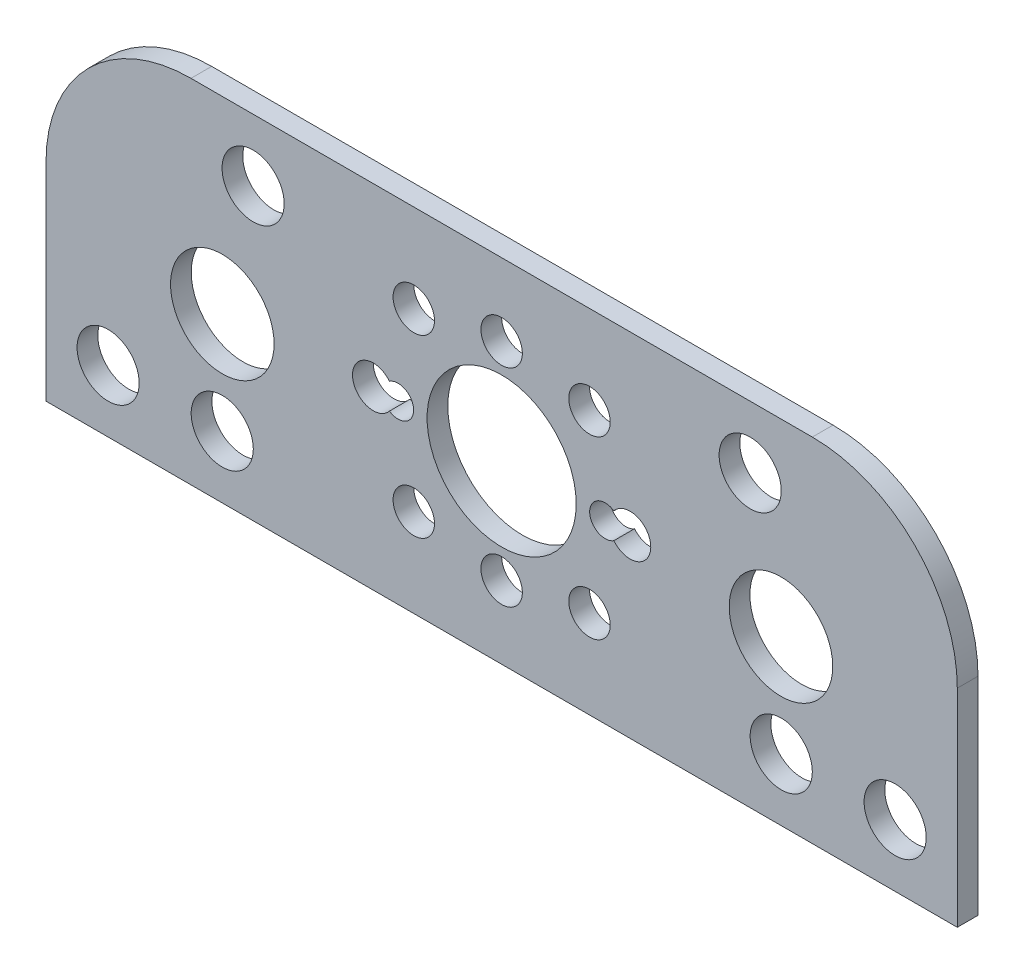
ISO-10303-21;
HEADER;
FILE_DESCRIPTION(('STEP AP214'),'2;1');
FILE_NAME('part.step','',(''),(''),'','','');
FILE_SCHEMA(('AUTOMOTIVE_DESIGN { 1 0 10303 214 1 1 1 1 }'));
ENDSEC;
DATA;
#1=APPLICATION_CONTEXT('core data for automotive mechanical design processes');
#2=APPLICATION_PROTOCOL_DEFINITION('international standard','automotive_design',2000,#1);
#3=PRODUCT_CONTEXT('',#1,'mechanical');
#4=PRODUCT('Part','Part','',(#3));
#5=PRODUCT_RELATED_PRODUCT_CATEGORY('part','',(#4));
#6=PRODUCT_DEFINITION_FORMATION('','',#4);
#7=PRODUCT_DEFINITION_CONTEXT('part definition',#1,'design');
#8=PRODUCT_DEFINITION('design','',#6,#7);
#9=PRODUCT_DEFINITION_SHAPE('','',#8);
#10=(LENGTH_UNIT() NAMED_UNIT(*) SI_UNIT(.MILLI.,.METRE.));
#11=(NAMED_UNIT(*) PLANE_ANGLE_UNIT() SI_UNIT($,.RADIAN.));
#12=(NAMED_UNIT(*) SI_UNIT($,.STERADIAN.) SOLID_ANGLE_UNIT());
#13=UNCERTAINTY_MEASURE_WITH_UNIT(LENGTH_MEASURE(1.E-05),#10,'distance_accuracy_value','');
#14=(GEOMETRIC_REPRESENTATION_CONTEXT(3) GLOBAL_UNCERTAINTY_ASSIGNED_CONTEXT((#13)) GLOBAL_UNIT_ASSIGNED_CONTEXT((#10,
#11,#12)) REPRESENTATION_CONTEXT('',''));
#15=CARTESIAN_POINT('',(0.,0.,0.));
#16=DIRECTION('',(0.,0.,1.));
#17=DIRECTION('',(1.,0.,0.));
#18=AXIS2_PLACEMENT_3D('',#15,#16,#17);
#19=CARTESIAN_POINT('',(22.,1.49999999999996,-1.));
#20=DIRECTION('',(1.,0.,0.));
#21=DIRECTION('',(0.,1.,0.));
#22=AXIS2_PLACEMENT_3D('',#19,#20,#21);
#23=PLANE('',#22);
#24=DIRECTION('',(0.,1.,0.));
#25=VECTOR('',#24,1.);
#26=CARTESIAN_POINT('',(22.,1.49999999999996,0.));
#27=LINE('',#26,#25);
#28=CARTESIAN_POINT('',(22.,-8.5,0.));
#29=VERTEX_POINT('',#28);
#30=CARTESIAN_POINT('',(22.,1.49999999999996,0.));
#31=VERTEX_POINT('',#30);
#32=EDGE_CURVE('E177',#29,#31,#27,.T.);
#33=ORIENTED_EDGE('',*,*,#32,.F.);
#34=DIRECTION('',(0.,0.,1.));
#35=VECTOR('',#34,1.);
#36=CARTESIAN_POINT('',(22.,-8.5,-1.));
#37=LINE('',#36,#35);
#38=CARTESIAN_POINT('',(22.,-8.5,-1.));
#39=VERTEX_POINT('',#38);
#40=EDGE_CURVE('E11',#39,#29,#37,.T.);
#41=ORIENTED_EDGE('',*,*,#40,.F.);
#42=DIRECTION('',(0.,1.,0.));
#43=VECTOR('',#42,1.);
#44=CARTESIAN_POINT('',(22.,1.49999999999996,-1.));
#45=LINE('',#44,#43);
#46=CARTESIAN_POINT('',(22.,1.49999999999996,-1.));
#47=VERTEX_POINT('',#46);
#48=EDGE_CURVE('E178',#39,#47,#45,.T.);
#49=ORIENTED_EDGE('',*,*,#48,.T.);
#50=DIRECTION('',(0.,0.,1.));
#51=VECTOR('',#50,1.);
#52=CARTESIAN_POINT('',(22.,1.49999999999996,-1.));
#53=LINE('',#52,#51);
#54=EDGE_CURVE('E44',#47,#31,#53,.T.);
#55=ORIENTED_EDGE('',*,*,#54,.T.);
#56=EDGE_LOOP('',(#33,#41,#49,#55));
#57=FACE_BOUND('',#56,.T.);
#58=ADVANCED_FACE('F41',(#57),#23,.T.);
#59=CARTESIAN_POINT('',(-22.,-8.5,-1.));
#60=DIRECTION('',(0.,-1.,0.));
#61=DIRECTION('',(0.,0.,-1.));
#62=AXIS2_PLACEMENT_3D('',#59,#60,#61);
#63=PLANE('',#62);
#64=DIRECTION('',(1.,0.,0.));
#65=VECTOR('',#64,1.);
#66=CARTESIAN_POINT('',(-22.,-8.5,0.));
#67=LINE('',#66,#65);
#68=CARTESIAN_POINT('',(-22.,-8.5,0.));
#69=VERTEX_POINT('',#68);
#70=EDGE_CURVE('E182',#69,#29,#67,.T.);
#71=ORIENTED_EDGE('',*,*,#70,.F.);
#72=DIRECTION('',(0.,0.,1.));
#73=VECTOR('',#72,1.);
#74=CARTESIAN_POINT('',(-22.,-8.5,-1.));
#75=LINE('',#74,#73);
#76=CARTESIAN_POINT('',(-22.,-8.5,-1.));
#77=VERTEX_POINT('',#76);
#78=EDGE_CURVE('E49',#77,#69,#75,.T.);
#79=ORIENTED_EDGE('',*,*,#78,.F.);
#80=DIRECTION('',(1.,0.,0.));
#81=VECTOR('',#80,1.);
#82=CARTESIAN_POINT('',(-22.,-8.5,-1.));
#83=LINE('',#82,#81);
#84=EDGE_CURVE('E194',#77,#39,#83,.T.);
#85=ORIENTED_EDGE('',*,*,#84,.T.);
#86=ORIENTED_EDGE('',*,*,#40,.T.);
#87=EDGE_LOOP('',(#71,#79,#85,#86));
#88=FACE_BOUND('',#87,.T.);
#89=ADVANCED_FACE('F230',(#88),#63,.T.);
#90=CARTESIAN_POINT('',(-22.,1.49999999999995,-1.));
#91=DIRECTION('',(-1.,0.,0.));
#92=DIRECTION('',(0.,-1.,0.));
#93=AXIS2_PLACEMENT_3D('',#90,#91,#92);
#94=PLANE('',#93);
#95=DIRECTION('',(0.,-1.,0.));
#96=VECTOR('',#95,1.);
#97=CARTESIAN_POINT('',(-22.,1.49999999999995,0.));
#98=LINE('',#97,#96);
#99=CARTESIAN_POINT('',(-22.,1.49999999999995,0.));
#100=VERTEX_POINT('',#99);
#101=EDGE_CURVE('E208',#100,#69,#98,.T.);
#102=ORIENTED_EDGE('',*,*,#101,.F.);
#103=DIRECTION('',(0.,0.,1.));
#104=VECTOR('',#103,1.);
#105=CARTESIAN_POINT('',(-22.,1.49999999999995,-1.));
#106=LINE('',#105,#104);
#107=CARTESIAN_POINT('',(-22.,1.49999999999995,-1.));
#108=VERTEX_POINT('',#107);
#109=EDGE_CURVE('E214',#108,#100,#106,.T.);
#110=ORIENTED_EDGE('',*,*,#109,.F.);
#111=DIRECTION('',(0.,-1.,0.));
#112=VECTOR('',#111,1.);
#113=CARTESIAN_POINT('',(-22.,1.49999999999995,-1.));
#114=LINE('',#113,#112);
#115=EDGE_CURVE('E191',#108,#77,#114,.T.);
#116=ORIENTED_EDGE('',*,*,#115,.T.);
#117=ORIENTED_EDGE('',*,*,#78,.T.);
#118=EDGE_LOOP('',(#102,#110,#116,#117));
#119=FACE_BOUND('',#118,.T.);
#120=ADVANCED_FACE('F243',(#119),#94,.T.);
#121=CARTESIAN_POINT('',(-15.,1.5,-1.));
#122=DIRECTION('',(0.,0.,1.));
#123=DIRECTION('',(1.,0.,0.));
#124=AXIS2_PLACEMENT_3D('',#121,#122,#123);
#125=CYLINDRICAL_SURFACE('',#124,7.);
#126=CARTESIAN_POINT('',(-15.,1.5,0.));
#127=DIRECTION('',(0.,0.,1.));
#128=DIRECTION('',(-1.,0.,0.));
#129=AXIS2_PLACEMENT_3D('',#126,#127,#128);
#130=CIRCLE('',#129,7.);
#131=CARTESIAN_POINT('',(-15.,8.5,0.));
#132=VERTEX_POINT('',#131);
#133=EDGE_CURVE('E205',#132,#100,#130,.T.);
#134=ORIENTED_EDGE('',*,*,#133,.F.);
#135=DIRECTION('',(0.,0.,1.));
#136=VECTOR('',#135,1.);
#137=CARTESIAN_POINT('',(-15.,8.5,-1.));
#138=LINE('',#137,#136);
#139=CARTESIAN_POINT('',(-15.,8.5,-1.));
#140=VERTEX_POINT('',#139);
#141=EDGE_CURVE('E216',#140,#132,#138,.T.);
#142=ORIENTED_EDGE('',*,*,#141,.F.);
#143=CARTESIAN_POINT('',(-15.,1.5,-1.));
#144=DIRECTION('',(0.,0.,1.));
#145=DIRECTION('',(-1.,0.,0.));
#146=AXIS2_PLACEMENT_3D('',#143,#144,#145);
#147=CIRCLE('',#146,7.);
#148=EDGE_CURVE('E188',#140,#108,#147,.T.);
#149=ORIENTED_EDGE('',*,*,#148,.T.);
#150=ORIENTED_EDGE('',*,*,#109,.T.);
#151=EDGE_LOOP('',(#134,#142,#149,#150));
#152=FACE_BOUND('',#151,.T.);
#153=ADVANCED_FACE('F241',(#152),#125,.T.);
#154=CARTESIAN_POINT('',(-15.,8.5,-1.));
#155=DIRECTION('',(0.,1.,0.));
#156=DIRECTION('',(0.,0.,1.));
#157=AXIS2_PLACEMENT_3D('',#154,#155,#156);
#158=PLANE('',#157);
#159=DIRECTION('',(-1.,0.,0.));
#160=VECTOR('',#159,1.);
#161=CARTESIAN_POINT('',(-15.,8.5,0.));
#162=LINE('',#161,#160);
#163=CARTESIAN_POINT('',(14.9999999999999,8.5,0.));
#164=VERTEX_POINT('',#163);
#165=EDGE_CURVE('E202',#164,#132,#162,.T.);
#166=ORIENTED_EDGE('',*,*,#165,.F.);
#167=DIRECTION('',(0.,0.,1.));
#168=VECTOR('',#167,1.);
#169=CARTESIAN_POINT('',(14.9999999999999,8.5,-1.));
#170=LINE('',#169,#168);
#171=CARTESIAN_POINT('',(14.9999999999999,8.5,-1.));
#172=VERTEX_POINT('',#171);
#173=EDGE_CURVE('E217',#172,#164,#170,.T.);
#174=ORIENTED_EDGE('',*,*,#173,.F.);
#175=DIRECTION('',(-1.,0.,0.));
#176=VECTOR('',#175,1.);
#177=CARTESIAN_POINT('',(-15.,8.5,-1.));
#178=LINE('',#177,#176);
#179=EDGE_CURVE('E185',#172,#140,#178,.T.);
#180=ORIENTED_EDGE('',*,*,#179,.T.);
#181=ORIENTED_EDGE('',*,*,#141,.T.);
#182=EDGE_LOOP('',(#166,#174,#180,#181));
#183=FACE_BOUND('',#182,.T.);
#184=ADVANCED_FACE('F238',(#183),#158,.T.);
#185=CARTESIAN_POINT('',(15.,1.5,-1.));
#186=DIRECTION('',(0.,0.,1.));
#187=DIRECTION('',(1.,0.,0.));
#188=AXIS2_PLACEMENT_3D('',#185,#186,#187);
#189=CYLINDRICAL_SURFACE('',#188,7.);
#190=CARTESIAN_POINT('',(15.,1.5,0.));
#191=DIRECTION('',(0.,0.,1.));
#192=DIRECTION('',(1.,0.,0.));
#193=AXIS2_PLACEMENT_3D('',#190,#191,#192);
#194=CIRCLE('',#193,7.);
#195=EDGE_CURVE('E199',#31,#164,#194,.T.);
#196=ORIENTED_EDGE('',*,*,#195,.F.);
#197=ORIENTED_EDGE('',*,*,#54,.F.);
#198=CARTESIAN_POINT('',(15.,1.5,-1.));
#199=DIRECTION('',(0.,0.,1.));
#200=DIRECTION('',(1.,0.,0.));
#201=AXIS2_PLACEMENT_3D('',#198,#199,#200);
#202=CIRCLE('',#201,7.);
#203=EDGE_CURVE('E181',#47,#172,#202,.T.);
#204=ORIENTED_EDGE('',*,*,#203,.T.);
#205=ORIENTED_EDGE('',*,*,#173,.T.);
#206=EDGE_LOOP('',(#196,#197,#204,#205));
#207=FACE_BOUND('',#206,.T.);
#208=ADVANCED_FACE('F225',(#207),#189,.T.);
#209=CARTESIAN_POINT('',(-15.,1.5,-1.));
#210=DIRECTION('',(0.,0.,-1.));
#211=DIRECTION('',(-1.,0.,0.));
#212=AXIS2_PLACEMENT_3D('',#209,#210,#211);
#213=PLANE('',#212);
#214=CARTESIAN_POINT('',(-19.,-5.5,-0.999999999999999));
#215=DIRECTION('',(0.,0.,-1.));
#216=DIRECTION('',(-1.,0.,0.));
#217=AXIS2_PLACEMENT_3D('',#214,#215,#216);
#218=CIRCLE('',#217,1.5);
#219=CARTESIAN_POINT('',(-20.5,-5.5,-0.999999999999999));
#220=VERTEX_POINT('',#219);
#221=EDGE_CURVE('E495',#220,#220,#218,.T.);
#222=ORIENTED_EDGE('',*,*,#221,.F.);
#223=EDGE_LOOP('',(#222));
#224=FACE_BOUND('',#223,.T.);
#225=CARTESIAN_POINT('',(13.5,-5.5,-0.999999999999999));
#226=DIRECTION('',(0.,0.,-1.));
#227=DIRECTION('',(-1.,0.,0.));
#228=AXIS2_PLACEMENT_3D('',#225,#226,#227);
#229=CIRCLE('',#228,1.5);
#230=CARTESIAN_POINT('',(12.,-5.5,-0.999999999999999));
#231=VERTEX_POINT('',#230);
#232=EDGE_CURVE('E528',#231,#231,#229,.T.);
#233=ORIENTED_EDGE('',*,*,#232,.F.);
#234=EDGE_LOOP('',(#233));
#235=FACE_BOUND('',#234,.T.);
#236=CARTESIAN_POINT('',(19.,-5.5,-0.999999999999999));
#237=DIRECTION('',(0.,0.,-1.));
#238=DIRECTION('',(-1.,0.,0.));
#239=AXIS2_PLACEMENT_3D('',#236,#237,#238);
#240=CIRCLE('',#239,1.5);
#241=CARTESIAN_POINT('',(17.5,-5.5,-0.999999999999999));
#242=VERTEX_POINT('',#241);
#243=EDGE_CURVE('E525',#242,#242,#240,.T.);
#244=ORIENTED_EDGE('',*,*,#243,.F.);
#245=EDGE_LOOP('',(#244));
#246=FACE_BOUND('',#245,.T.);
#247=CARTESIAN_POINT('',(-12.,5.5,-0.999999999999999));
#248=DIRECTION('',(0.,0.,-1.));
#249=DIRECTION('',(-1.,0.,0.));
#250=AXIS2_PLACEMENT_3D('',#247,#248,#249);
#251=CIRCLE('',#250,1.5);
#252=CARTESIAN_POINT('',(-13.5,5.5,-0.999999999999999));
#253=VERTEX_POINT('',#252);
#254=EDGE_CURVE('E522',#253,#253,#251,.T.);
#255=ORIENTED_EDGE('',*,*,#254,.F.);
#256=EDGE_LOOP('',(#255));
#257=FACE_BOUND('',#256,.T.);
#258=CARTESIAN_POINT('',(11.9999999999999,5.5,-0.999999999999999));
#259=DIRECTION('',(0.,0.,-1.));
#260=DIRECTION('',(-1.,0.,0.));
#261=AXIS2_PLACEMENT_3D('',#258,#259,#260);
#262=CIRCLE('',#261,1.5);
#263=CARTESIAN_POINT('',(10.4999999999999,5.5,-0.999999999999999));
#264=VERTEX_POINT('',#263);
#265=EDGE_CURVE('E503',#264,#264,#262,.T.);
#266=ORIENTED_EDGE('',*,*,#265,.F.);
#267=EDGE_LOOP('',(#266));
#268=FACE_BOUND('',#267,.T.);
#269=CARTESIAN_POINT('',(-13.490737563232,-5.5,-0.999999999999999));
#270=DIRECTION('',(0.,0.,-1.));
#271=DIRECTION('',(-1.,0.,0.));
#272=AXIS2_PLACEMENT_3D('',#269,#270,#271);
#273=CIRCLE('',#272,1.5);
#274=CARTESIAN_POINT('',(-14.990737563232,-5.5,-0.999999999999999));
#275=VERTEX_POINT('',#274);
#276=EDGE_CURVE('E499',#275,#275,#273,.T.);
#277=ORIENTED_EDGE('',*,*,#276,.F.);
#278=EDGE_LOOP('',(#277));
#279=FACE_BOUND('',#278,.T.);
#280=CARTESIAN_POINT('',(-13.4866600757934,-0.6,-1.));
#281=DIRECTION('',(0.,0.,-1.));
#282=DIRECTION('',(-1.,0.,0.));
#283=AXIS2_PLACEMENT_3D('',#280,#281,#282);
#284=CIRCLE('',#283,2.5);
#285=CARTESIAN_POINT('',(-15.9866600757934,-0.6,-1.));
#286=VERTEX_POINT('',#285);
#287=EDGE_CURVE('E541',#286,#286,#284,.T.);
#288=ORIENTED_EDGE('',*,*,#287,.F.);
#289=EDGE_LOOP('',(#288));
#290=FACE_BOUND('',#289,.T.);
#291=CARTESIAN_POINT('',(13.4866600757934,-0.6,-1.));
#292=DIRECTION('',(0.,0.,-1.));
#293=DIRECTION('',(-1.,0.,0.));
#294=AXIS2_PLACEMENT_3D('',#291,#292,#293);
#295=CIRCLE('',#294,2.49999999999999);
#296=CARTESIAN_POINT('',(10.9866600757934,-0.6,-1.));
#297=VERTEX_POINT('',#296);
#298=EDGE_CURVE('E536',#297,#297,#295,.T.);
#299=ORIENTED_EDGE('',*,*,#298,.F.);
#300=EDGE_LOOP('',(#299));
#301=FACE_BOUND('',#300,.T.);
#302=CARTESIAN_POINT('',(0.,5.,-1.));
#303=DIRECTION('',(0.,0.,-1.));
#304=DIRECTION('',(-1.,0.,0.));
#305=AXIS2_PLACEMENT_3D('',#302,#303,#304);
#306=CIRCLE('',#305,1.);
#307=CARTESIAN_POINT('',(-1.,5.,-1.));
#308=VERTEX_POINT('',#307);
#309=EDGE_CURVE('E174',#308,#308,#306,.T.);
#310=ORIENTED_EDGE('',*,*,#309,.F.);
#311=EDGE_LOOP('',(#310));
#312=FACE_BOUND('',#311,.T.);
#313=CARTESIAN_POINT('',(0.,-5.,-1.));
#314=DIRECTION('',(0.,0.,-1.));
#315=DIRECTION('',(-1.,0.,0.));
#316=AXIS2_PLACEMENT_3D('',#313,#314,#315);
#317=CIRCLE('',#316,1.);
#318=CARTESIAN_POINT('',(-1.,-5.,-1.));
#319=VERTEX_POINT('',#318);
#320=EDGE_CURVE('E171',#319,#319,#317,.T.);
#321=ORIENTED_EDGE('',*,*,#320,.F.);
#322=EDGE_LOOP('',(#321));
#323=FACE_BOUND('',#322,.T.);
#324=CARTESIAN_POINT('',(-4.24264068711928,4.24264068711929,-1.));
#325=DIRECTION('',(0.,0.,-1.));
#326=DIRECTION('',(-1.,0.,0.));
#327=AXIS2_PLACEMENT_3D('',#324,#325,#326);
#328=CIRCLE('',#327,1.);
#329=CARTESIAN_POINT('',(-5.24264068711928,4.24264068711929,-1.));
#330=VERTEX_POINT('',#329);
#331=EDGE_CURVE('E168',#330,#330,#328,.T.);
#332=ORIENTED_EDGE('',*,*,#331,.F.);
#333=EDGE_LOOP('',(#332));
#334=FACE_BOUND('',#333,.T.);
#335=CARTESIAN_POINT('',(-6.2,0.,-1.));
#336=DIRECTION('',(0.,0.,-1.));
#337=DIRECTION('',(-1.,0.,0.));
#338=AXIS2_PLACEMENT_3D('',#335,#336,#337);
#339=CIRCLE('',#338,1.);
#340=CARTESIAN_POINT('',(-5.41770833333333,-0.622912311857687,-1.));
#341=VERTEX_POINT('',#340);
#342=CARTESIAN_POINT('',(-5.41770833333333,0.622912311857687,-1.));
#343=VERTEX_POINT('',#342);
#344=EDGE_CURVE('E122',#341,#343,#339,.T.);
#345=ORIENTED_EDGE('',*,*,#344,.F.);
#346=CARTESIAN_POINT('',(-5.,0.,-1.));
#347=DIRECTION('',(0.,0.,-1.));
#348=DIRECTION('',(-1.,0.,0.));
#349=AXIS2_PLACEMENT_3D('',#346,#347,#348);
#350=CIRCLE('',#349,0.75);
#351=EDGE_CURVE('E165',#343,#341,#350,.T.);
#352=ORIENTED_EDGE('',*,*,#351,.F.);
#353=EDGE_LOOP('',(#345,#352));
#354=FACE_BOUND('',#353,.T.);
#355=CARTESIAN_POINT('',(4.24264068711928,-4.24264068711929,-1.));
#356=DIRECTION('',(0.,0.,-1.));
#357=DIRECTION('',(-1.,0.,0.));
#358=AXIS2_PLACEMENT_3D('',#355,#356,#357);
#359=CIRCLE('',#358,1.);
#360=CARTESIAN_POINT('',(3.24264068711928,-4.24264068711929,-1.));
#361=VERTEX_POINT('',#360);
#362=EDGE_CURVE('E162',#361,#361,#359,.T.);
#363=ORIENTED_EDGE('',*,*,#362,.F.);
#364=EDGE_LOOP('',(#363));
#365=FACE_BOUND('',#364,.T.);
#366=CARTESIAN_POINT('',(-4.24264068711928,-4.24264068711929,-1.));
#367=DIRECTION('',(0.,0.,-1.));
#368=DIRECTION('',(-1.,0.,0.));
#369=AXIS2_PLACEMENT_3D('',#366,#367,#368);
#370=CIRCLE('',#369,1.);
#371=CARTESIAN_POINT('',(-5.24264068711928,-4.24264068711929,-1.));
#372=VERTEX_POINT('',#371);
#373=EDGE_CURVE('E159',#372,#372,#370,.T.);
#374=ORIENTED_EDGE('',*,*,#373,.F.);
#375=EDGE_LOOP('',(#374));
#376=FACE_BOUND('',#375,.T.);
#377=CARTESIAN_POINT('',(0.,0.,-1.));
#378=DIRECTION('',(0.,0.,-1.));
#379=DIRECTION('',(-1.,0.,0.));
#380=AXIS2_PLACEMENT_3D('',#377,#378,#379);
#381=CIRCLE('',#380,3.6);
#382=CARTESIAN_POINT('',(-3.6,0.,-1.));
#383=VERTEX_POINT('',#382);
#384=EDGE_CURVE('E156',#383,#383,#381,.T.);
#385=ORIENTED_EDGE('',*,*,#384,.F.);
#386=EDGE_LOOP('',(#385));
#387=FACE_BOUND('',#386,.T.);
#388=CARTESIAN_POINT('',(4.24264068711928,4.24264068711929,-1.));
#389=DIRECTION('',(0.,0.,-1.));
#390=DIRECTION('',(-1.,0.,0.));
#391=AXIS2_PLACEMENT_3D('',#388,#389,#390);
#392=CIRCLE('',#391,1.);
#393=CARTESIAN_POINT('',(3.24264068711928,4.24264068711929,-1.));
#394=VERTEX_POINT('',#393);
#395=EDGE_CURVE('E153',#394,#394,#392,.T.);
#396=ORIENTED_EDGE('',*,*,#395,.F.);
#397=EDGE_LOOP('',(#396));
#398=FACE_BOUND('',#397,.T.);
#399=CARTESIAN_POINT('',(6.2,0.,-1.));
#400=DIRECTION('',(0.,0.,-1.));
#401=DIRECTION('',(-1.,0.,0.));
#402=AXIS2_PLACEMENT_3D('',#399,#400,#401);
#403=CIRCLE('',#402,1.);
#404=CARTESIAN_POINT('',(5.41770833333333,0.622912311857687,-1.));
#405=VERTEX_POINT('',#404);
#406=CARTESIAN_POINT('',(5.41770833333333,-0.622912311857687,-1.));
#407=VERTEX_POINT('',#406);
#408=EDGE_CURVE('E151',#405,#407,#403,.T.);
#409=ORIENTED_EDGE('',*,*,#408,.F.);
#410=CARTESIAN_POINT('',(5.,0.,-1.));
#411=DIRECTION('',(0.,0.,-1.));
#412=DIRECTION('',(-1.,0.,0.));
#413=AXIS2_PLACEMENT_3D('',#410,#411,#412);
#414=CIRCLE('',#413,0.75);
#415=EDGE_CURVE('E147',#407,#405,#414,.T.);
#416=ORIENTED_EDGE('',*,*,#415,.F.);
#417=EDGE_LOOP('',(#409,#416));
#418=FACE_BOUND('',#417,.T.);
#419=ORIENTED_EDGE('',*,*,#48,.F.);
#420=ORIENTED_EDGE('',*,*,#84,.F.);
#421=ORIENTED_EDGE('',*,*,#115,.F.);
#422=ORIENTED_EDGE('',*,*,#148,.F.);
#423=ORIENTED_EDGE('',*,*,#179,.F.);
#424=ORIENTED_EDGE('',*,*,#203,.F.);
#425=EDGE_LOOP('',(#419,#420,#421,#422,#423,#424));
#426=FACE_BOUND('',#425,.T.);
#427=ADVANCED_FACE('F233',(#224,#235,#246,#257,#268,#279,#290,#301,#312,#323,#334,#354,#365,
#376,#387,#398,#418,#426),#213,.T.);
#428=CARTESIAN_POINT('',(-15.,1.5,0.));
#429=DIRECTION('',(0.,0.,-1.));
#430=DIRECTION('',(-1.,0.,0.));
#431=AXIS2_PLACEMENT_3D('',#428,#429,#430);
#432=PLANE('',#431);
#433=CARTESIAN_POINT('',(-19.,-5.5,0.));
#434=DIRECTION('',(0.,0.,1.));
#435=DIRECTION('',(1.,0.,0.));
#436=AXIS2_PLACEMENT_3D('',#433,#434,#435);
#437=CIRCLE('',#436,1.5);
#438=CARTESIAN_POINT('',(-17.5,-5.5,0.));
#439=VERTEX_POINT('',#438);
#440=EDGE_CURVE('E498',#439,#439,#437,.T.);
#441=ORIENTED_EDGE('',*,*,#440,.F.);
#442=EDGE_LOOP('',(#441));
#443=FACE_BOUND('',#442,.T.);
#444=CARTESIAN_POINT('',(13.5,-5.5,0.));
#445=DIRECTION('',(0.,0.,1.));
#446=DIRECTION('',(1.,0.,0.));
#447=AXIS2_PLACEMENT_3D('',#444,#445,#446);
#448=CIRCLE('',#447,1.5);
#449=CARTESIAN_POINT('',(15.,-5.5,0.));
#450=VERTEX_POINT('',#449);
#451=EDGE_CURVE('E509',#450,#450,#448,.T.);
#452=ORIENTED_EDGE('',*,*,#451,.F.);
#453=EDGE_LOOP('',(#452));
#454=FACE_BOUND('',#453,.T.);
#455=CARTESIAN_POINT('',(19.,-5.5,0.));
#456=DIRECTION('',(0.,0.,1.));
#457=DIRECTION('',(1.,0.,0.));
#458=AXIS2_PLACEMENT_3D('',#455,#456,#457);
#459=CIRCLE('',#458,1.5);
#460=CARTESIAN_POINT('',(20.5,-5.5,0.));
#461=VERTEX_POINT('',#460);
#462=EDGE_CURVE('E500',#461,#461,#459,.T.);
#463=ORIENTED_EDGE('',*,*,#462,.F.);
#464=EDGE_LOOP('',(#463));
#465=FACE_BOUND('',#464,.T.);
#466=CARTESIAN_POINT('',(-12.,5.5,0.));
#467=DIRECTION('',(0.,0.,1.));
#468=DIRECTION('',(1.,0.,0.));
#469=AXIS2_PLACEMENT_3D('',#466,#467,#468);
#470=CIRCLE('',#469,1.5);
#471=CARTESIAN_POINT('',(-10.5,5.5,0.));
#472=VERTEX_POINT('',#471);
#473=EDGE_CURVE('E506',#472,#472,#470,.T.);
#474=ORIENTED_EDGE('',*,*,#473,.F.);
#475=EDGE_LOOP('',(#474));
#476=FACE_BOUND('',#475,.T.);
#477=CARTESIAN_POINT('',(11.9999999999999,5.5,0.));
#478=DIRECTION('',(0.,0.,1.));
#479=DIRECTION('',(1.,0.,0.));
#480=AXIS2_PLACEMENT_3D('',#477,#478,#479);
#481=CIRCLE('',#480,1.5);
#482=CARTESIAN_POINT('',(13.4999999999999,5.5,0.));
#483=VERTEX_POINT('',#482);
#484=EDGE_CURVE('E513',#483,#483,#481,.T.);
#485=ORIENTED_EDGE('',*,*,#484,.F.);
#486=EDGE_LOOP('',(#485));
#487=FACE_BOUND('',#486,.T.);
#488=CARTESIAN_POINT('',(-13.490737563232,-5.5,0.));
#489=DIRECTION('',(0.,0.,1.));
#490=DIRECTION('',(1.,0.,0.));
#491=AXIS2_PLACEMENT_3D('',#488,#489,#490);
#492=CIRCLE('',#491,1.5);
#493=CARTESIAN_POINT('',(-11.990737563232,-5.5,0.));
#494=VERTEX_POINT('',#493);
#495=EDGE_CURVE('E512',#494,#494,#492,.T.);
#496=ORIENTED_EDGE('',*,*,#495,.F.);
#497=EDGE_LOOP('',(#496));
#498=FACE_BOUND('',#497,.T.);
#499=CARTESIAN_POINT('',(-13.4866600757934,-0.6,0.));
#500=DIRECTION('',(0.,0.,1.));
#501=DIRECTION('',(1.,0.,0.));
#502=AXIS2_PLACEMENT_3D('',#499,#500,#501);
#503=CIRCLE('',#502,2.5);
#504=CARTESIAN_POINT('',(-10.9866600757934,-0.6,0.));
#505=VERTEX_POINT('',#504);
#506=EDGE_CURVE('E533',#505,#505,#503,.T.);
#507=ORIENTED_EDGE('',*,*,#506,.F.);
#508=EDGE_LOOP('',(#507));
#509=FACE_BOUND('',#508,.T.);
#510=CARTESIAN_POINT('',(13.4866600757934,-0.6,0.));
#511=DIRECTION('',(0.,0.,1.));
#512=DIRECTION('',(1.,0.,0.));
#513=AXIS2_PLACEMENT_3D('',#510,#511,#512);
#514=CIRCLE('',#513,2.49999999999999);
#515=CARTESIAN_POINT('',(15.9866600757934,-0.6,0.));
#516=VERTEX_POINT('',#515);
#517=EDGE_CURVE('E532',#516,#516,#514,.T.);
#518=ORIENTED_EDGE('',*,*,#517,.F.);
#519=EDGE_LOOP('',(#518));
#520=FACE_BOUND('',#519,.T.);
#521=CARTESIAN_POINT('',(0.,5.,0.));
#522=DIRECTION('',(0.,0.,1.));
#523=DIRECTION('',(1.,0.,0.));
#524=AXIS2_PLACEMENT_3D('',#521,#522,#523);
#525=CIRCLE('',#524,1.);
#526=CARTESIAN_POINT('',(1.,5.,0.));
#527=VERTEX_POINT('',#526);
#528=EDGE_CURVE('E143',#527,#527,#525,.T.);
#529=ORIENTED_EDGE('',*,*,#528,.F.);
#530=EDGE_LOOP('',(#529));
#531=FACE_BOUND('',#530,.T.);
#532=CARTESIAN_POINT('',(0.,-5.,0.));
#533=DIRECTION('',(0.,0.,1.));
#534=DIRECTION('',(1.,0.,0.));
#535=AXIS2_PLACEMENT_3D('',#532,#533,#534);
#536=CIRCLE('',#535,1.);
#537=CARTESIAN_POINT('',(1.,-5.,0.));
#538=VERTEX_POINT('',#537);
#539=EDGE_CURVE('E137',#538,#538,#536,.T.);
#540=ORIENTED_EDGE('',*,*,#539,.F.);
#541=EDGE_LOOP('',(#540));
#542=FACE_BOUND('',#541,.T.);
#543=CARTESIAN_POINT('',(-4.24264068711928,4.24264068711929,0.));
#544=DIRECTION('',(0.,0.,1.));
#545=DIRECTION('',(1.,0.,0.));
#546=AXIS2_PLACEMENT_3D('',#543,#544,#545);
#547=CIRCLE('',#546,1.);
#548=CARTESIAN_POINT('',(-3.24264068711928,4.24264068711929,0.));
#549=VERTEX_POINT('',#548);
#550=EDGE_CURVE('E134',#549,#549,#547,.T.);
#551=ORIENTED_EDGE('',*,*,#550,.F.);
#552=EDGE_LOOP('',(#551));
#553=FACE_BOUND('',#552,.T.);
#554=CARTESIAN_POINT('',(-5.,0.,0.));
#555=DIRECTION('',(0.,0.,1.));
#556=DIRECTION('',(1.,0.,0.));
#557=AXIS2_PLACEMENT_3D('',#554,#555,#556);
#558=CIRCLE('',#557,0.75);
#559=CARTESIAN_POINT('',(-5.41770833333333,-0.622912311857687,0.));
#560=VERTEX_POINT('',#559);
#561=CARTESIAN_POINT('',(-5.41770833333333,0.622912311857687,0.));
#562=VERTEX_POINT('',#561);
#563=EDGE_CURVE('E128',#560,#562,#558,.T.);
#564=ORIENTED_EDGE('',*,*,#563,.F.);
#565=CARTESIAN_POINT('',(-6.2,0.,0.));
#566=DIRECTION('',(0.,0.,1.));
#567=DIRECTION('',(1.,0.,0.));
#568=AXIS2_PLACEMENT_3D('',#565,#566,#567);
#569=CIRCLE('',#568,1.);
#570=EDGE_CURVE('E119',#562,#560,#569,.T.);
#571=ORIENTED_EDGE('',*,*,#570,.F.);
#572=EDGE_LOOP('',(#564,#571));
#573=FACE_BOUND('',#572,.T.);
#574=CARTESIAN_POINT('',(4.24264068711928,-4.24264068711929,0.));
#575=DIRECTION('',(0.,0.,1.));
#576=DIRECTION('',(1.,0.,0.));
#577=AXIS2_PLACEMENT_3D('',#574,#575,#576);
#578=CIRCLE('',#577,1.);
#579=CARTESIAN_POINT('',(5.24264068711928,-4.24264068711929,0.));
#580=VERTEX_POINT('',#579);
#581=EDGE_CURVE('E544',#580,#580,#578,.T.);
#582=ORIENTED_EDGE('',*,*,#581,.F.);
#583=EDGE_LOOP('',(#582));
#584=FACE_BOUND('',#583,.T.);
#585=CARTESIAN_POINT('',(-4.24264068711928,-4.24264068711929,0.));
#586=DIRECTION('',(0.,0.,1.));
#587=DIRECTION('',(1.,0.,0.));
#588=AXIS2_PLACEMENT_3D('',#585,#586,#587);
#589=CIRCLE('',#588,1.);
#590=CARTESIAN_POINT('',(-3.24264068711928,-4.24264068711929,0.));
#591=VERTEX_POINT('',#590);
#592=EDGE_CURVE('E545',#591,#591,#589,.T.);
#593=ORIENTED_EDGE('',*,*,#592,.F.);
#594=EDGE_LOOP('',(#593));
#595=FACE_BOUND('',#594,.T.);
#596=CARTESIAN_POINT('',(0.,0.,0.));
#597=DIRECTION('',(0.,0.,1.));
#598=DIRECTION('',(1.,0.,0.));
#599=AXIS2_PLACEMENT_3D('',#596,#597,#598);
#600=CIRCLE('',#599,3.6);
#601=CARTESIAN_POINT('',(3.6,0.,0.));
#602=VERTEX_POINT('',#601);
#603=EDGE_CURVE('E125',#602,#602,#600,.T.);
#604=ORIENTED_EDGE('',*,*,#603,.F.);
#605=EDGE_LOOP('',(#604));
#606=FACE_BOUND('',#605,.T.);
#607=CARTESIAN_POINT('',(4.24264068711928,4.24264068711929,0.));
#608=DIRECTION('',(0.,0.,1.));
#609=DIRECTION('',(1.,0.,0.));
#610=AXIS2_PLACEMENT_3D('',#607,#608,#609);
#611=CIRCLE('',#610,1.);
#612=CARTESIAN_POINT('',(5.24264068711928,4.24264068711929,0.));
#613=VERTEX_POINT('',#612);
#614=EDGE_CURVE('E548',#613,#613,#611,.T.);
#615=ORIENTED_EDGE('',*,*,#614,.F.);
#616=EDGE_LOOP('',(#615));
#617=FACE_BOUND('',#616,.T.);
#618=CARTESIAN_POINT('',(5.,0.,0.));
#619=DIRECTION('',(0.,0.,1.));
#620=DIRECTION('',(1.,0.,0.));
#621=AXIS2_PLACEMENT_3D('',#618,#619,#620);
#622=CIRCLE('',#621,0.75);
#623=CARTESIAN_POINT('',(5.41770833333333,0.622912311857687,0.));
#624=VERTEX_POINT('',#623);
#625=CARTESIAN_POINT('',(5.41770833333333,-0.622912311857687,0.));
#626=VERTEX_POINT('',#625);
#627=EDGE_CURVE('E142',#624,#626,#622,.T.);
#628=ORIENTED_EDGE('',*,*,#627,.F.);
#629=CARTESIAN_POINT('',(6.2,0.,0.));
#630=DIRECTION('',(0.,0.,1.));
#631=DIRECTION('',(1.,0.,0.));
#632=AXIS2_PLACEMENT_3D('',#629,#630,#631);
#633=CIRCLE('',#632,1.);
#634=EDGE_CURVE('E140',#626,#624,#633,.T.);
#635=ORIENTED_EDGE('',*,*,#634,.F.);
#636=EDGE_LOOP('',(#628,#635));
#637=FACE_BOUND('',#636,.T.);
#638=ORIENTED_EDGE('',*,*,#32,.T.);
#639=ORIENTED_EDGE('',*,*,#195,.T.);
#640=ORIENTED_EDGE('',*,*,#165,.T.);
#641=ORIENTED_EDGE('',*,*,#133,.T.);
#642=ORIENTED_EDGE('',*,*,#101,.T.);
#643=ORIENTED_EDGE('',*,*,#70,.T.);
#644=EDGE_LOOP('',(#638,#639,#640,#641,#642,#643));
#645=FACE_BOUND('',#644,.T.);
#646=ADVANCED_FACE('F132',(#443,#454,#465,#476,#487,#498,#509,#520,#531,#542,#553,#573,#584,
#595,#606,#617,#637,#645),#432,.F.);
#647=CARTESIAN_POINT('',(6.2,0.,-2.));
#648=DIRECTION('',(0.,0.,1.));
#649=DIRECTION('',(1.,0.,0.));
#650=AXIS2_PLACEMENT_3D('',#647,#648,#649);
#651=CYLINDRICAL_SURFACE('',#650,1.);
#652=ORIENTED_EDGE('',*,*,#408,.T.);
#653=DIRECTION('',(0.,0.,1.));
#654=VECTOR('',#653,1.);
#655=CARTESIAN_POINT('',(5.41770833333333,-0.622912311857687,-2.));
#656=LINE('',#655,#654);
#657=EDGE_CURVE('E65',#407,#626,#656,.T.);
#658=ORIENTED_EDGE('',*,*,#657,.T.);
#659=ORIENTED_EDGE('',*,*,#634,.T.);
#660=DIRECTION('',(0.,0.,1.));
#661=VECTOR('',#660,1.);
#662=CARTESIAN_POINT('',(5.41770833333333,0.622912311857687,-2.));
#663=LINE('',#662,#661);
#664=EDGE_CURVE('E145',#405,#624,#663,.T.);
#665=ORIENTED_EDGE('',*,*,#664,.F.);
#666=EDGE_LOOP('',(#652,#658,#659,#665));
#667=FACE_BOUND('',#666,.T.);
#668=ADVANCED_FACE('F306',(#667),#651,.F.);
#669=CARTESIAN_POINT('',(5.,0.,-2.));
#670=DIRECTION('',(0.,0.,1.));
#671=DIRECTION('',(1.,0.,0.));
#672=AXIS2_PLACEMENT_3D('',#669,#670,#671);
#673=CYLINDRICAL_SURFACE('',#672,0.75);
#674=ORIENTED_EDGE('',*,*,#415,.T.);
#675=ORIENTED_EDGE('',*,*,#664,.T.);
#676=ORIENTED_EDGE('',*,*,#627,.T.);
#677=ORIENTED_EDGE('',*,*,#657,.F.);
#678=EDGE_LOOP('',(#674,#675,#676,#677));
#679=FACE_BOUND('',#678,.T.);
#680=ADVANCED_FACE('F316',(#679),#673,.F.);
#681=CARTESIAN_POINT('',(4.24264068711928,4.24264068711929,-2.));
#682=DIRECTION('',(0.,0.,1.));
#683=DIRECTION('',(1.,0.,0.));
#684=AXIS2_PLACEMENT_3D('',#681,#682,#683);
#685=CYLINDRICAL_SURFACE('',#684,1.);
#686=ORIENTED_EDGE('',*,*,#395,.T.);
#687=EDGE_LOOP('',(#686));
#688=FACE_BOUND('',#687,.T.);
#689=ORIENTED_EDGE('',*,*,#614,.T.);
#690=EDGE_LOOP('',(#689));
#691=FACE_BOUND('',#690,.T.);
#692=ADVANCED_FACE('F326',(#688,#691),#685,.F.);
#693=CARTESIAN_POINT('',(0.,0.,-2.));
#694=DIRECTION('',(0.,0.,1.));
#695=DIRECTION('',(1.,0.,0.));
#696=AXIS2_PLACEMENT_3D('',#693,#694,#695);
#697=CYLINDRICAL_SURFACE('',#696,3.6);
#698=ORIENTED_EDGE('',*,*,#384,.T.);
#699=EDGE_LOOP('',(#698));
#700=FACE_BOUND('',#699,.T.);
#701=ORIENTED_EDGE('',*,*,#603,.T.);
#702=EDGE_LOOP('',(#701));
#703=FACE_BOUND('',#702,.T.);
#704=ADVANCED_FACE('F335',(#700,#703),#697,.F.);
#705=CARTESIAN_POINT('',(-4.24264068711928,-4.24264068711929,-2.));
#706=DIRECTION('',(0.,0.,1.));
#707=DIRECTION('',(1.,0.,0.));
#708=AXIS2_PLACEMENT_3D('',#705,#706,#707);
#709=CYLINDRICAL_SURFACE('',#708,1.);
#710=ORIENTED_EDGE('',*,*,#373,.T.);
#711=EDGE_LOOP('',(#710));
#712=FACE_BOUND('',#711,.T.);
#713=ORIENTED_EDGE('',*,*,#592,.T.);
#714=EDGE_LOOP('',(#713));
#715=FACE_BOUND('',#714,.T.);
#716=ADVANCED_FACE('F345',(#712,#715),#709,.F.);
#717=CARTESIAN_POINT('',(4.24264068711928,-4.24264068711929,-2.));
#718=DIRECTION('',(0.,0.,1.));
#719=DIRECTION('',(1.,0.,0.));
#720=AXIS2_PLACEMENT_3D('',#717,#718,#719);
#721=CYLINDRICAL_SURFACE('',#720,1.);
#722=ORIENTED_EDGE('',*,*,#362,.T.);
#723=EDGE_LOOP('',(#722));
#724=FACE_BOUND('',#723,.T.);
#725=ORIENTED_EDGE('',*,*,#581,.T.);
#726=EDGE_LOOP('',(#725));
#727=FACE_BOUND('',#726,.T.);
#728=ADVANCED_FACE('F355',(#724,#727),#721,.F.);
#729=CARTESIAN_POINT('',(-6.2,0.,-2.));
#730=DIRECTION('',(0.,0.,1.));
#731=DIRECTION('',(1.,0.,0.));
#732=AXIS2_PLACEMENT_3D('',#729,#730,#731);
#733=CYLINDRICAL_SURFACE('',#732,1.);
#734=ORIENTED_EDGE('',*,*,#344,.T.);
#735=DIRECTION('',(0.,0.,1.));
#736=VECTOR('',#735,1.);
#737=CARTESIAN_POINT('',(-5.41770833333333,0.622912311857687,-2.));
#738=LINE('',#737,#736);
#739=EDGE_CURVE('E57',#343,#562,#738,.T.);
#740=ORIENTED_EDGE('',*,*,#739,.T.);
#741=ORIENTED_EDGE('',*,*,#570,.T.);
#742=DIRECTION('',(0.,0.,1.));
#743=VECTOR('',#742,1.);
#744=CARTESIAN_POINT('',(-5.41770833333333,-0.622912311857687,-2.));
#745=LINE('',#744,#743);
#746=EDGE_CURVE('E124',#341,#560,#745,.T.);
#747=ORIENTED_EDGE('',*,*,#746,.F.);
#748=EDGE_LOOP('',(#734,#740,#741,#747));
#749=FACE_BOUND('',#748,.T.);
#750=ADVANCED_FACE('F116',(#749),#733,.F.);
#751=CARTESIAN_POINT('',(-5.,0.,-2.));
#752=DIRECTION('',(0.,0.,1.));
#753=DIRECTION('',(1.,0.,0.));
#754=AXIS2_PLACEMENT_3D('',#751,#752,#753);
#755=CYLINDRICAL_SURFACE('',#754,0.75);
#756=ORIENTED_EDGE('',*,*,#351,.T.);
#757=ORIENTED_EDGE('',*,*,#746,.T.);
#758=ORIENTED_EDGE('',*,*,#563,.T.);
#759=ORIENTED_EDGE('',*,*,#739,.F.);
#760=EDGE_LOOP('',(#756,#757,#758,#759));
#761=FACE_BOUND('',#760,.T.);
#762=ADVANCED_FACE('F129',(#761),#755,.F.);
#763=CARTESIAN_POINT('',(-4.24264068711928,4.24264068711929,-2.));
#764=DIRECTION('',(0.,0.,1.));
#765=DIRECTION('',(1.,0.,0.));
#766=AXIS2_PLACEMENT_3D('',#763,#764,#765);
#767=CYLINDRICAL_SURFACE('',#766,1.);
#768=ORIENTED_EDGE('',*,*,#331,.T.);
#769=EDGE_LOOP('',(#768));
#770=FACE_BOUND('',#769,.T.);
#771=ORIENTED_EDGE('',*,*,#550,.T.);
#772=EDGE_LOOP('',(#771));
#773=FACE_BOUND('',#772,.T.);
#774=ADVANCED_FACE('F382',(#770,#773),#767,.F.);
#775=CARTESIAN_POINT('',(0.,-5.,-2.));
#776=DIRECTION('',(0.,0.,1.));
#777=DIRECTION('',(1.,0.,0.));
#778=AXIS2_PLACEMENT_3D('',#775,#776,#777);
#779=CYLINDRICAL_SURFACE('',#778,1.);
#780=ORIENTED_EDGE('',*,*,#320,.T.);
#781=EDGE_LOOP('',(#780));
#782=FACE_BOUND('',#781,.T.);
#783=ORIENTED_EDGE('',*,*,#539,.T.);
#784=EDGE_LOOP('',(#783));
#785=FACE_BOUND('',#784,.T.);
#786=ADVANCED_FACE('F391',(#782,#785),#779,.F.);
#787=CARTESIAN_POINT('',(0.,5.,-2.));
#788=DIRECTION('',(0.,0.,1.));
#789=DIRECTION('',(1.,0.,0.));
#790=AXIS2_PLACEMENT_3D('',#787,#788,#789);
#791=CYLINDRICAL_SURFACE('',#790,1.);
#792=ORIENTED_EDGE('',*,*,#309,.T.);
#793=EDGE_LOOP('',(#792));
#794=FACE_BOUND('',#793,.T.);
#795=ORIENTED_EDGE('',*,*,#528,.T.);
#796=EDGE_LOOP('',(#795));
#797=FACE_BOUND('',#796,.T.);
#798=ADVANCED_FACE('F401',(#794,#797),#791,.F.);
#799=CARTESIAN_POINT('',(13.4866600757934,-0.6,-2.));
#800=DIRECTION('',(0.,0.,1.));
#801=DIRECTION('',(1.,0.,0.));
#802=AXIS2_PLACEMENT_3D('',#799,#800,#801);
#803=CYLINDRICAL_SURFACE('',#802,2.49999999999999);
#804=ORIENTED_EDGE('',*,*,#298,.T.);
#805=EDGE_LOOP('',(#804));
#806=FACE_BOUND('',#805,.T.);
#807=ORIENTED_EDGE('',*,*,#517,.T.);
#808=EDGE_LOOP('',(#807));
#809=FACE_BOUND('',#808,.T.);
#810=ADVANCED_FACE('F411',(#806,#809),#803,.F.);
#811=CARTESIAN_POINT('',(-13.4866600757934,-0.6,-2.));
#812=DIRECTION('',(0.,0.,1.));
#813=DIRECTION('',(1.,0.,0.));
#814=AXIS2_PLACEMENT_3D('',#811,#812,#813);
#815=CYLINDRICAL_SURFACE('',#814,2.5);
#816=ORIENTED_EDGE('',*,*,#287,.T.);
#817=EDGE_LOOP('',(#816));
#818=FACE_BOUND('',#817,.T.);
#819=ORIENTED_EDGE('',*,*,#506,.T.);
#820=EDGE_LOOP('',(#819));
#821=FACE_BOUND('',#820,.T.);
#822=ADVANCED_FACE('F421',(#818,#821),#815,.F.);
#823=CARTESIAN_POINT('',(-13.490737563232,-5.5,-10.));
#824=DIRECTION('',(0.,0.,1.));
#825=DIRECTION('',(1.,0.,0.));
#826=AXIS2_PLACEMENT_3D('',#823,#824,#825);
#827=CYLINDRICAL_SURFACE('',#826,1.5);
#828=ORIENTED_EDGE('',*,*,#276,.T.);
#829=EDGE_LOOP('',(#828));
#830=FACE_BOUND('',#829,.T.);
#831=ORIENTED_EDGE('',*,*,#495,.T.);
#832=EDGE_LOOP('',(#831));
#833=FACE_BOUND('',#832,.T.);
#834=ADVANCED_FACE('F430',(#830,#833),#827,.F.);
#835=CARTESIAN_POINT('',(11.9999999999999,5.5,-10.));
#836=DIRECTION('',(0.,0.,1.));
#837=DIRECTION('',(1.,0.,0.));
#838=AXIS2_PLACEMENT_3D('',#835,#836,#837);
#839=CYLINDRICAL_SURFACE('',#838,1.5);
#840=ORIENTED_EDGE('',*,*,#265,.T.);
#841=EDGE_LOOP('',(#840));
#842=FACE_BOUND('',#841,.T.);
#843=ORIENTED_EDGE('',*,*,#484,.T.);
#844=EDGE_LOOP('',(#843));
#845=FACE_BOUND('',#844,.T.);
#846=ADVANCED_FACE('F439',(#842,#845),#839,.F.);
#847=CARTESIAN_POINT('',(-12.,5.5,-10.));
#848=DIRECTION('',(0.,0.,1.));
#849=DIRECTION('',(1.,0.,0.));
#850=AXIS2_PLACEMENT_3D('',#847,#848,#849);
#851=CYLINDRICAL_SURFACE('',#850,1.5);
#852=ORIENTED_EDGE('',*,*,#254,.T.);
#853=EDGE_LOOP('',(#852));
#854=FACE_BOUND('',#853,.T.);
#855=ORIENTED_EDGE('',*,*,#473,.T.);
#856=EDGE_LOOP('',(#855));
#857=FACE_BOUND('',#856,.T.);
#858=ADVANCED_FACE('F449',(#854,#857),#851,.F.);
#859=CARTESIAN_POINT('',(19.,-5.5,-10.));
#860=DIRECTION('',(0.,0.,1.));
#861=DIRECTION('',(1.,0.,0.));
#862=AXIS2_PLACEMENT_3D('',#859,#860,#861);
#863=CYLINDRICAL_SURFACE('',#862,1.5);
#864=ORIENTED_EDGE('',*,*,#243,.T.);
#865=EDGE_LOOP('',(#864));
#866=FACE_BOUND('',#865,.T.);
#867=ORIENTED_EDGE('',*,*,#462,.T.);
#868=EDGE_LOOP('',(#867));
#869=FACE_BOUND('',#868,.T.);
#870=ADVANCED_FACE('F459',(#866,#869),#863,.F.);
#871=CARTESIAN_POINT('',(13.5,-5.5,-10.));
#872=DIRECTION('',(0.,0.,1.));
#873=DIRECTION('',(1.,0.,0.));
#874=AXIS2_PLACEMENT_3D('',#871,#872,#873);
#875=CYLINDRICAL_SURFACE('',#874,1.5);
#876=ORIENTED_EDGE('',*,*,#232,.T.);
#877=EDGE_LOOP('',(#876));
#878=FACE_BOUND('',#877,.T.);
#879=ORIENTED_EDGE('',*,*,#451,.T.);
#880=EDGE_LOOP('',(#879));
#881=FACE_BOUND('',#880,.T.);
#882=ADVANCED_FACE('F469',(#878,#881),#875,.F.);
#883=CARTESIAN_POINT('',(-19.,-5.5,-10.));
#884=DIRECTION('',(0.,0.,1.));
#885=DIRECTION('',(1.,0.,0.));
#886=AXIS2_PLACEMENT_3D('',#883,#884,#885);
#887=CYLINDRICAL_SURFACE('',#886,1.5);
#888=ORIENTED_EDGE('',*,*,#221,.T.);
#889=EDGE_LOOP('',(#888));
#890=FACE_BOUND('',#889,.T.);
#891=ORIENTED_EDGE('',*,*,#440,.T.);
#892=EDGE_LOOP('',(#891));
#893=FACE_BOUND('',#892,.T.);
#894=ADVANCED_FACE('F479',(#890,#893),#887,.F.);
#895=CLOSED_SHELL('',(#58,#89,#120,#153,#184,#208,#427,#646,#668,#680,#692,#704,#716,#728,#750,
#762,#774,#786,#798,#810,#822,#834,#846,#858,#870,#882,#894));
#896=MANIFOLD_SOLID_BREP('B2',#895);
#897=ADVANCED_BREP_SHAPE_REPRESENTATION('',(#18,#896),#14);
#898=SHAPE_DEFINITION_REPRESENTATION(#9,#897);
ENDSEC;
END-ISO-10303-21;
